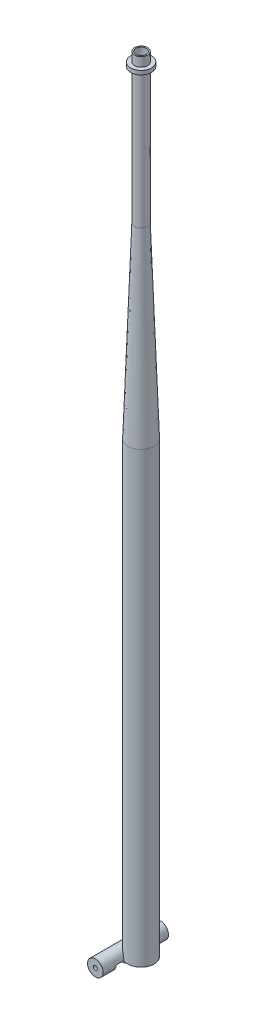
ISO-10303-21;
HEADER;
FILE_DESCRIPTION(('STEP AP214'),'2;1');
FILE_NAME('part.step','',(''),(''),'','','');
FILE_SCHEMA(('AUTOMOTIVE_DESIGN { 1 0 10303 214 1 1 1 1 }'));
ENDSEC;
DATA;
#1=APPLICATION_CONTEXT('core data for automotive mechanical design processes');
#2=APPLICATION_PROTOCOL_DEFINITION('international standard','automotive_design',2000,#1);
#3=PRODUCT_CONTEXT('',#1,'mechanical');
#4=PRODUCT('Part','Part','',(#3));
#5=PRODUCT_RELATED_PRODUCT_CATEGORY('part','',(#4));
#6=PRODUCT_DEFINITION_FORMATION('','',#4);
#7=PRODUCT_DEFINITION_CONTEXT('part definition',#1,'design');
#8=PRODUCT_DEFINITION('design','',#6,#7);
#9=PRODUCT_DEFINITION_SHAPE('','',#8);
#10=(LENGTH_UNIT() NAMED_UNIT(*) SI_UNIT(.MILLI.,.METRE.));
#11=(NAMED_UNIT(*) PLANE_ANGLE_UNIT() SI_UNIT($,.RADIAN.));
#12=(NAMED_UNIT(*) SI_UNIT($,.STERADIAN.) SOLID_ANGLE_UNIT());
#13=UNCERTAINTY_MEASURE_WITH_UNIT(LENGTH_MEASURE(1.E-05),#10,'distance_accuracy_value','');
#14=(GEOMETRIC_REPRESENTATION_CONTEXT(3) GLOBAL_UNCERTAINTY_ASSIGNED_CONTEXT((#13)) GLOBAL_UNIT_ASSIGNED_CONTEXT((#10,
#11,#12)) REPRESENTATION_CONTEXT('',''));
#15=CARTESIAN_POINT('',(0.,0.,0.));
#16=DIRECTION('',(0.,0.,1.));
#17=DIRECTION('',(1.,0.,0.));
#18=AXIS2_PLACEMENT_3D('',#15,#16,#17);
#19=CARTESIAN_POINT('',(0.,0.,0.));
#20=DIRECTION('',(0.,1.,0.));
#21=DIRECTION('',(0.,0.,1.));
#22=AXIS2_PLACEMENT_3D('',#19,#20,#21);
#23=PLANE('',#22);
#24=DIRECTION('',(1.,0.,0.));
#25=VECTOR('',#24,1.);
#26=CARTESIAN_POINT('',(-16.,0.,5.));
#27=LINE('',#26,#25);
#28=CARTESIAN_POINT('',(-16.,0.,5.));
#29=VERTEX_POINT('',#28);
#30=CARTESIAN_POINT('',(-11.5,0.,5.));
#31=VERTEX_POINT('',#30);
#32=EDGE_CURVE('E120',#29,#31,#27,.T.);
#33=ORIENTED_EDGE('',*,*,#32,.T.);
#34=DIRECTION('',(0.,0.,1.));
#35=VECTOR('',#34,1.);
#36=CARTESIAN_POINT('',(-11.5,0.,-25.));
#37=LINE('',#36,#35);
#38=CARTESIAN_POINT('',(-11.5,0.,15.));
#39=VERTEX_POINT('',#38);
#40=EDGE_CURVE('E110',#31,#39,#37,.T.);
#41=ORIENTED_EDGE('',*,*,#40,.T.);
#42=DIRECTION('',(1.,0.,0.));
#43=VECTOR('',#42,1.);
#44=CARTESIAN_POINT('',(-16.,0.,15.));
#45=LINE('',#44,#43);
#46=CARTESIAN_POINT('',(-16.,0.,15.));
#47=VERTEX_POINT('',#46);
#48=EDGE_CURVE('E118',#47,#39,#45,.T.);
#49=ORIENTED_EDGE('',*,*,#48,.F.);
#50=DIRECTION('',(0.,0.,1.));
#51=VECTOR('',#50,1.);
#52=CARTESIAN_POINT('',(-16.,0.,15.));
#53=LINE('',#52,#51);
#54=EDGE_CURVE('E136',#29,#47,#53,.T.);
#55=ORIENTED_EDGE('',*,*,#54,.F.);
#56=EDGE_LOOP('',(#33,#41,#49,#55));
#57=FACE_BOUND('',#56,.T.);
#58=ADVANCED_FACE('F38',(#57),#23,.F.);
#59=DIRECTION('',(1.,0.,0.));
#60=VECTOR('',#59,1.);
#61=CARTESIAN_POINT('',(-16.,0.,-15.));
#62=LINE('',#61,#60);
#63=CARTESIAN_POINT('',(-16.,0.,-15.));
#64=VERTEX_POINT('',#63);
#65=CARTESIAN_POINT('',(-11.5,0.,-15.));
#66=VERTEX_POINT('',#65);
#67=EDGE_CURVE('E145',#64,#66,#62,.T.);
#68=ORIENTED_EDGE('',*,*,#67,.T.);
#69=CARTESIAN_POINT('',(-11.5,0.,-5.));
#70=VERTEX_POINT('',#69);
#71=EDGE_CURVE('E123',#66,#70,#37,.T.);
#72=ORIENTED_EDGE('',*,*,#71,.T.);
#73=DIRECTION('',(1.,0.,0.));
#74=VECTOR('',#73,1.);
#75=CARTESIAN_POINT('',(-16.,0.,-5.));
#76=LINE('',#75,#74);
#77=CARTESIAN_POINT('',(-16.,0.,-5.));
#78=VERTEX_POINT('',#77);
#79=EDGE_CURVE('E149',#78,#70,#76,.T.);
#80=ORIENTED_EDGE('',*,*,#79,.F.);
#81=DIRECTION('',(0.,0.,1.));
#82=VECTOR('',#81,1.);
#83=CARTESIAN_POINT('',(-16.,0.,-5.));
#84=LINE('',#83,#82);
#85=EDGE_CURVE('E140',#64,#78,#84,.T.);
#86=ORIENTED_EDGE('',*,*,#85,.F.);
#87=EDGE_LOOP('',(#68,#72,#80,#86));
#88=FACE_BOUND('',#87,.T.);
#89=ADVANCED_FACE('F201',(#88),#23,.F.);
#90=CARTESIAN_POINT('',(0.,200.,0.));
#91=DIRECTION('',(0.,-1.,0.));
#92=DIRECTION('',(0.,0.,-1.));
#93=AXIS2_PLACEMENT_3D('',#90,#91,#92);
#94=CYLINDRICAL_SURFACE('',#93,10.);
#95=CARTESIAN_POINT('',(0.,343.181266414644,0.));
#96=DIRECTION('',(0.,-1.,0.));
#97=DIRECTION('',(0.,0.,-1.));
#98=AXIS2_PLACEMENT_3D('',#95,#96,#97);
#99=CIRCLE('',#98,10.);
#100=CARTESIAN_POINT('',(0.,343.181266414644,-10.));
#101=VERTEX_POINT('',#100);
#102=EDGE_CURVE('E250',#101,#101,#99,.T.);
#103=ORIENTED_EDGE('',*,*,#102,.T.);
#104=EDGE_LOOP('',(#103));
#105=FACE_BOUND('',#104,.T.);
#106=CARTESIAN_POINT('',(-4.,0.,9.16515138991168));
#107=CARTESIAN_POINT('',(-3.99997778219047,0.153225202512064,9.16513254831111));
#108=CARTESIAN_POINT('',(-4.00586857910908,0.306450219080829,9.16258920397449));
#109=CARTESIAN_POINT('',(-4.02931819606878,0.611833229554031,9.15231657073001));
#110=CARTESIAN_POINT('',(-4.04687727342484,0.763991199852628,9.14458716745645));
#111=CARTESIAN_POINT('',(-4.09350596385244,1.06617006140088,9.12380522893392));
#112=CARTESIAN_POINT('',(-4.12257583952362,1.21619090381464,9.11075257224359));
#113=CARTESIAN_POINT('',(-4.19190300986143,1.51302060117775,9.07906439958033));
#114=CARTESIAN_POINT('',(-4.23215998148825,1.6598295487421,9.06042904481278));
#115=CARTESIAN_POINT('',(-4.32345484793833,1.94933213960151,9.01722165662655));
#116=CARTESIAN_POINT('',(-4.37450386776996,2.09202136221083,8.99264349326236));
#117=CARTESIAN_POINT('',(-4.48674524799118,2.37208311001329,8.93717145606689));
#118=CARTESIAN_POINT('',(-4.54793743293795,2.50945572711524,8.90627769147223));
#119=CARTESIAN_POINT('',(-4.67964207350768,2.77778899230716,8.83778544132786));
#120=CARTESIAN_POINT('',(-4.75014770052152,2.9087542427811,8.80019186109412));
#121=CARTESIAN_POINT('',(-4.89956904335798,3.16344770693432,8.71788356873646));
#122=CARTESIAN_POINT('',(-4.97848459089161,3.28717606535266,8.67316899910017));
#123=CARTESIAN_POINT('',(-5.14261199535865,3.52511212963572,8.57685724328394));
#124=CARTESIAN_POINT('',(-5.22773553618571,3.63941737809661,8.52535044304135));
#125=CARTESIAN_POINT('',(-5.40389792806963,3.85949644005836,8.41479034397009));
#126=CARTESIAN_POINT('',(-5.49493669192846,3.96527037927022,8.35573715637249));
#127=CARTESIAN_POINT('',(-5.68162079935943,4.16780175220397,8.22993625906027));
#128=CARTESIAN_POINT('',(-5.7772664627874,4.26455855849594,8.16318801463022));
#129=CARTESIAN_POINT('',(-5.97178183929896,4.44875287168095,8.02198618883176));
#130=CARTESIAN_POINT('',(-6.07065160490569,4.53619022665366,7.94753248189232));
#131=CARTESIAN_POINT('',(-6.27111108039896,4.70239205559036,7.79034841165227));
#132=CARTESIAN_POINT('',(-6.37271710852397,4.78107302667334,7.70755069973457));
#133=CARTESIAN_POINT('',(-6.57642174218811,4.92899170301371,7.53448994532213));
#134=CARTESIAN_POINT('',(-6.67852033927459,4.99822956972541,7.44422703050676));
#135=CARTESIAN_POINT('',(-6.88195825565414,5.12760689326641,7.25656955593302));
#136=CARTESIAN_POINT('',(-6.98329741133182,5.18774444019384,7.15917350547678));
#137=CARTESIAN_POINT('',(-7.18406481740443,5.29940658545861,6.95769043402865));
#138=CARTESIAN_POINT('',(-7.28349268226228,5.35092946188812,6.85360208111633));
#139=CARTESIAN_POINT('',(-7.51626263559682,5.46383495915283,6.59891419464829));
#140=CARTESIAN_POINT('',(-7.64830909338256,5.52164734670514,6.44553479598772));
#141=CARTESIAN_POINT('',(-7.90477090859937,5.62397522715187,6.12831515057242));
#142=CARTESIAN_POINT('',(-8.02918389829309,5.66848661076545,5.96447168993211));
#143=CARTESIAN_POINT('',(-8.26899071996326,5.74626213413622,5.62731437860279));
#144=CARTESIAN_POINT('',(-8.38436719861967,5.77950502279746,5.45398334226739));
#145=CARTESIAN_POINT('',(-8.60466266264139,5.83660701280445,5.09935093534154));
#146=CARTESIAN_POINT('',(-8.70958128793691,5.86046579113325,4.91804929062806));
#147=CARTESIAN_POINT('',(-8.93466427954141,5.90606151090021,4.49915452944504));
#148=CARTESIAN_POINT('',(-9.05140650467224,5.92552624055263,4.25946953787316));
#149=CARTESIAN_POINT('',(-9.26553895648297,5.9558595131586,3.77106649636677));
#150=CARTESIAN_POINT('',(-9.36292434152859,5.96672590747242,3.52234620482945));
#151=CARTESIAN_POINT('',(-9.53753659249294,5.9827934907367,3.0177284499861));
#152=CARTESIAN_POINT('',(-9.61476099670632,5.98799398811299,2.76183011444389));
#153=CARTESIAN_POINT('',(-9.74847920856982,5.99509980955035,2.24465855048996));
#154=CARTESIAN_POINT('',(-9.80497449725853,5.99700536906185,1.98338570748124));
#155=CARTESIAN_POINT('',(-9.89730026275323,5.99930072674919,1.4546915867135));
#156=CARTESIAN_POINT('',(-9.93293275662073,5.99967619825349,1.18723567223012));
#157=CARTESIAN_POINT('',(-9.9824733285806,6.00002562602308,0.65031717369554));
#158=CARTESIAN_POINT('',(-9.99638114767714,5.99999957750159,0.380854565759542));
#159=CARTESIAN_POINT('',(-10.0023812394145,6.00000036053418,-0.158361899833576));
#160=CARTESIAN_POINT('',(-9.99446966848423,6.00002720140469,-0.428115800436205));
#161=CARTESIAN_POINT('',(-9.95687504681856,5.9998741592151,-0.966102278355277));
#162=CARTESIAN_POINT('',(-9.92719176027435,5.99969427391593,-1.23433483916242));
#163=CARTESIAN_POINT('',(-9.84449242361924,5.99813367544932,-1.77907524652317));
#164=CARTESIAN_POINT('',(-9.79052183696139,5.99670131050609,-2.05543859225935));
#165=CARTESIAN_POINT('',(-9.65947263406435,5.9906876427503,-2.60264202932769));
#166=CARTESIAN_POINT('',(-9.58239096641654,5.98610592401808,-2.87348138626867));
#167=CARTESIAN_POINT('',(-9.40575219096876,5.97115738046493,-3.40747550276633));
#168=CARTESIAN_POINT('',(-9.30620279502734,5.96079253885936,-3.67063286418356));
#169=CARTESIAN_POINT('',(-9.0855078166487,5.93094430892148,-4.18716458927452));
#170=CARTESIAN_POINT('',(-8.96436938318733,5.91146393563795,-4.44054215773376));
#171=CARTESIAN_POINT('',(-8.73558350392088,5.86609869151014,-4.87164396528593));
#172=CARTESIAN_POINT('',(-8.63245846375421,5.84314256937369,-5.05208861891003));
#173=CARTESIAN_POINT('',(-8.41585465526807,5.78817483510347,-5.40520643335287));
#174=CARTESIAN_POINT('',(-8.30237825479174,5.75616529041189,-5.5778813580463));
#175=CARTESIAN_POINT('',(-8.06635283015041,5.68122453920425,-5.91405680606877));
#176=CARTESIAN_POINT('',(-7.94381808878375,5.63831027689263,-6.0775710868303));
#177=CARTESIAN_POINT('',(-7.69103792658546,5.53959283645505,-6.39444869318188));
#178=CARTESIAN_POINT('',(-7.56079410698639,5.48379232795966,-6.54781411284619));
#179=CARTESIAN_POINT('',(-7.32052407595796,5.36977481547948,-6.81436582914304));
#180=CARTESIAN_POINT('',(-7.21149724710685,5.31414237177383,-6.92956219969201));
#181=CARTESIAN_POINT('',(-6.99105688450113,5.19250416331599,-7.15189568458479));
#182=CARTESIAN_POINT('',(-6.87964389294637,5.12650073397615,-7.25903460535033));
#183=CARTESIAN_POINT('',(-6.65595554046045,4.98347084449821,-7.46467239996539));
#184=CARTESIAN_POINT('',(-6.54368037873156,4.90644686217662,-7.56317320796531));
#185=CARTESIAN_POINT('',(-6.31995075224077,4.74094860849784,-7.75110098729479));
#186=CARTESIAN_POINT('',(-6.20849629700955,4.65247420439042,-7.84052785340437));
#187=CARTESIAN_POINT('',(-5.98763011674107,4.46342167406336,-8.01048161481178));
#188=CARTESIAN_POINT('',(-5.87823350912391,4.362777925323,-8.09095531626187));
#189=CARTESIAN_POINT('',(-5.6640625991058,4.14999159346871,-8.24230524473547));
#190=CARTESIAN_POINT('',(-5.55928838305744,4.03784879566684,-8.31318129251288));
#191=CARTESIAN_POINT('',(-5.35625836926277,3.80260458350273,-8.44542363441317));
#192=CARTESIAN_POINT('',(-5.25800207391133,3.67950400738706,-8.50679065497363));
#193=CARTESIAN_POINT('',(-5.06975849202509,3.42315636259772,-8.62030371910424));
#194=CARTESIAN_POINT('',(-4.97977053354164,3.28991012005119,-8.67245051229991));
#195=CARTESIAN_POINT('',(-4.81770739902086,3.02742937489506,-8.76341800872111));
#196=CARTESIAN_POINT('',(-4.74474260689511,2.89901743745589,-8.80303424727697));
#197=CARTESIAN_POINT('',(-4.6078342214625,2.63563519882056,-8.87546418102119));
#198=CARTESIAN_POINT('',(-4.54389034979148,2.50066510016652,-8.90827808612806));
#199=CARTESIAN_POINT('',(-4.42583942795345,2.22512994666828,-8.96751414008314));
#200=CARTESIAN_POINT('',(-4.37173306907188,2.08456449948237,-8.99393583979196));
#201=CARTESIAN_POINT('',(-4.27401914659507,1.79886919414208,-9.04077981158458));
#202=CARTESIAN_POINT('',(-4.23041058605309,1.65373977089704,-9.06120265340386));
#203=CARTESIAN_POINT('',(-4.16054503032758,1.38447117446451,-9.09346381467836));
#204=CARTESIAN_POINT('',(-4.13260723291465,1.26086717751727,-9.10616572785124));
#205=CARTESIAN_POINT('',(-4.08457313072066,1.01183197047441,-9.12781208480819));
#206=CARTESIAN_POINT('',(-4.06447584944549,0.886400989939533,-9.13675699651721));
#207=CARTESIAN_POINT('',(-4.03228927003066,0.634453840509129,-9.15100925749045));
#208=CARTESIAN_POINT('',(-4.02019116756719,0.507939020487487,-9.1563206062723));
#209=CARTESIAN_POINT('',(-4.00404090355378,0.254283074171204,-9.16338735149828));
#210=CARTESIAN_POINT('',(-3.99998968534063,0.127141876197441,-9.16514233102949));
#211=CARTESIAN_POINT('',(-4.,0.,-9.16515138991168));
#212=B_SPLINE_CURVE_WITH_KNOTS('',3,(#106,#107,#108,#109,#110,#111,#112,#113,#114,#115,#116,
#117,#118,#119,#120,#121,#122,#123,#124,#125,#126,#127,#128,#129,#130,#131,#132,#133,#134,#135,
#136,#137,#138,#139,#140,#141,#142,#143,#144,#145,#146,#147,#148,#149,#150,#151,#152,#153,#154,
#155,#156,#157,#158,#159,#160,#161,#162,#163,#164,#165,#166,#167,#168,#169,#170,#171,#172,#173,
#174,#175,#176,#177,#178,#179,#180,#181,#182,#183,#184,#185,#186,#187,#188,#189,#190,#191,#192,
#193,#194,#195,#196,#197,#198,#199,#200,#201,#202,#203,#204,#205,#206,#207,#208,#209,#210,#211),
.UNSPECIFIED.,.F.,.F.,(4,2,2,2,2,2,2,2,2,2,2,2,2,2,2,2,2,2,2,2,2,2,2,2,2,2,2,2,2,2,2,2,2,2,2,2,
2,2,2,2,2,2,2,2,2,2,2,2,2,2,2,2,4),(0.,0.459541473371342,0.919093081125991,1.37865517338749,
1.83820399666244,2.29822887727497,2.75824580182619,3.21792729524277,3.6775995918056,
4.13167756877734,4.58574885357255,5.03985170999098,5.49396196780009,5.95208663886993,
6.41020347613011,6.86841632631762,7.32672065528192,7.9572426360196,8.58795921255536,
9.21985871578428,9.85177996815904,10.6526287232293,11.4536775394093,12.2548241199218,
13.0559134495514,13.8644866204113,14.6730694307931,15.4817946853053,16.290528699227,
17.1342762521656,17.9781352561078,18.8217050518707,19.6649960259144,20.2917598722541,
20.9183807060223,21.5440337614615,22.1695573170834,22.6733231005062,23.1769756045158,
23.6805150467634,24.1840603273082,24.6904533966605,25.1968559221237,25.7032197421151,
26.2095423746235,26.667737436832,27.1259183571366,27.58413146154,28.0423010335353,
28.4240725813736,28.8057965664292,29.1870997031511,29.5684475374284),.UNSPECIFIED.);
#213=CARTESIAN_POINT('',(-4.,0.,9.16515138991168));
#214=VERTEX_POINT('',#213);
#215=CARTESIAN_POINT('',(-4.,0.,-9.16515138991169));
#216=VERTEX_POINT('',#215);
#217=EDGE_CURVE('E153',#214,#216,#212,.T.);
#218=ORIENTED_EDGE('',*,*,#217,.F.);
#219=CARTESIAN_POINT('',(0.,0.,0.));
#220=DIRECTION('',(0.,1.,0.));
#221=DIRECTION('',(0.,0.,1.));
#222=AXIS2_PLACEMENT_3D('',#219,#220,#221);
#223=CIRCLE('',#222,10.);
#224=EDGE_CURVE('E222',#214,#216,#223,.T.);
#225=ORIENTED_EDGE('',*,*,#224,.T.);
#226=EDGE_LOOP('',(#218,#225));
#227=FACE_BOUND('',#226,.T.);
#228=ADVANCED_FACE('F166',(#105,#227),#94,.T.);
#229=CARTESIAN_POINT('',(-8.5,0.,15.));
#230=VERTEX_POINT('',#229);
#231=CARTESIAN_POINT('',(-4.,0.,15.));
#232=VERTEX_POINT('',#231);
#233=EDGE_CURVE('E129',#230,#232,#45,.T.);
#234=ORIENTED_EDGE('',*,*,#233,.F.);
#235=DIRECTION('',(0.,0.,1.));
#236=VECTOR('',#235,1.);
#237=CARTESIAN_POINT('',(-8.5,0.,-25.));
#238=LINE('',#237,#236);
#239=CARTESIAN_POINT('',(-8.5,0.,5.));
#240=VERTEX_POINT('',#239);
#241=EDGE_CURVE('E61',#230,#240,#238,.F.);
#242=ORIENTED_EDGE('',*,*,#241,.T.);
#243=CARTESIAN_POINT('',(-4.,0.,5.));
#244=VERTEX_POINT('',#243);
#245=EDGE_CURVE('E139',#240,#244,#27,.T.);
#246=ORIENTED_EDGE('',*,*,#245,.T.);
#247=DIRECTION('',(0.,0.,-1.));
#248=VECTOR('',#247,1.);
#249=CARTESIAN_POINT('',(-4.,0.,25.));
#250=LINE('',#249,#248);
#251=CARTESIAN_POINT('',(-4.,0.,0.));
#252=VERTEX_POINT('',#251);
#253=EDGE_CURVE('E240',#252,#244,#250,.F.);
#254=ORIENTED_EDGE('',*,*,#253,.F.);
#255=CARTESIAN_POINT('',(0.,0.,0.));
#256=DIRECTION('',(0.,1.,0.));
#257=DIRECTION('',(0.,0.,1.));
#258=AXIS2_PLACEMENT_3D('',#255,#256,#257);
#259=CIRCLE('',#258,4.);
#260=EDGE_CURVE('E260',#252,#252,#259,.T.);
#261=ORIENTED_EDGE('',*,*,#260,.T.);
#262=CARTESIAN_POINT('',(-4.,0.,-5.));
#263=VERTEX_POINT('',#262);
#264=EDGE_CURVE('E239',#263,#252,#250,.F.);
#265=ORIENTED_EDGE('',*,*,#264,.F.);
#266=CARTESIAN_POINT('',(-8.5,0.,-5.));
#267=VERTEX_POINT('',#266);
#268=EDGE_CURVE('E143',#267,#263,#76,.T.);
#269=ORIENTED_EDGE('',*,*,#268,.F.);
#270=CARTESIAN_POINT('',(-8.5,0.,-15.));
#271=VERTEX_POINT('',#270);
#272=EDGE_CURVE('E53',#267,#271,#238,.F.);
#273=ORIENTED_EDGE('',*,*,#272,.T.);
#274=CARTESIAN_POINT('',(-4.,0.,-15.));
#275=VERTEX_POINT('',#274);
#276=EDGE_CURVE('E148',#271,#275,#62,.T.);
#277=ORIENTED_EDGE('',*,*,#276,.T.);
#278=DIRECTION('',(0.,0.,-1.));
#279=VECTOR('',#278,1.);
#280=CARTESIAN_POINT('',(-4.,0.,25.));
#281=LINE('',#280,#279);
#282=EDGE_CURVE('E227',#216,#275,#281,.T.);
#283=ORIENTED_EDGE('',*,*,#282,.F.);
#284=ORIENTED_EDGE('',*,*,#224,.F.);
#285=DIRECTION('',(0.,0.,-1.));
#286=VECTOR('',#285,1.);
#287=CARTESIAN_POINT('',(-4.,0.,25.));
#288=LINE('',#287,#286);
#289=EDGE_CURVE('E46',#232,#214,#288,.T.);
#290=ORIENTED_EDGE('',*,*,#289,.F.);
#291=EDGE_LOOP('',(#234,#242,#246,#254,#261,#265,#269,#273,#277,#283,#284,#290));
#292=FACE_BOUND('',#291,.T.);
#293=ADVANCED_FACE('F203',(#292),#23,.F.);
#294=CARTESIAN_POINT('',(0.,600.,0.));
#295=DIRECTION('',(0.,-1.,0.));
#296=DIRECTION('',(0.,0.,-1.));
#297=AXIS2_PLACEMENT_3D('',#294,#295,#296);
#298=CYLINDRICAL_SURFACE('',#297,5.);
#299=CARTESIAN_POINT('',(0.,486.362532829231,0.));
#300=DIRECTION('',(0.,1.,0.));
#301=DIRECTION('',(0.,0.,1.));
#302=AXIS2_PLACEMENT_3D('',#299,#300,#301);
#303=CIRCLE('',#302,5.);
#304=CARTESIAN_POINT('',(0.,486.362532829231,5.));
#305=VERTEX_POINT('',#304);
#306=EDGE_CURVE('E253',#305,#305,#303,.T.);
#307=ORIENTED_EDGE('',*,*,#306,.T.);
#308=EDGE_LOOP('',(#307));
#309=FACE_BOUND('',#308,.T.);
#310=CARTESIAN_POINT('',(0.,590.,0.));
#311=DIRECTION('',(0.,1.,0.));
#312=DIRECTION('',(0.,0.,1.));
#313=AXIS2_PLACEMENT_3D('',#310,#311,#312);
#314=CIRCLE('',#313,5.);
#315=CARTESIAN_POINT('',(0.,590.,5.));
#316=VERTEX_POINT('',#315);
#317=EDGE_CURVE('E243',#316,#316,#314,.T.);
#318=ORIENTED_EDGE('',*,*,#317,.F.);
#319=EDGE_LOOP('',(#318));
#320=FACE_BOUND('',#319,.T.);
#321=ADVANCED_FACE('F209',(#309,#320),#298,.T.);
#322=CARTESIAN_POINT('',(0.,593.,0.));
#323=DIRECTION('',(0.,1.,0.));
#324=DIRECTION('',(0.,0.,1.));
#325=AXIS2_PLACEMENT_3D('',#322,#323,#324);
#326=CIRCLE('',#325,5.);
#327=CARTESIAN_POINT('',(0.,593.,5.));
#328=VERTEX_POINT('',#327);
#329=EDGE_CURVE('E244',#328,#328,#326,.T.);
#330=ORIENTED_EDGE('',*,*,#329,.T.);
#331=EDGE_LOOP('',(#330));
#332=FACE_BOUND('',#331,.T.);
#333=CARTESIAN_POINT('',(0.,600.,0.));
#334=DIRECTION('',(0.,1.,0.));
#335=DIRECTION('',(0.,0.,1.));
#336=AXIS2_PLACEMENT_3D('',#333,#334,#335);
#337=CIRCLE('',#336,5.);
#338=CARTESIAN_POINT('',(0.,600.,5.));
#339=VERTEX_POINT('',#338);
#340=EDGE_CURVE('E256',#339,#339,#337,.T.);
#341=ORIENTED_EDGE('',*,*,#340,.F.);
#342=EDGE_LOOP('',(#341));
#343=FACE_BOUND('',#342,.T.);
#344=ADVANCED_FACE('F215',(#332,#343),#298,.T.);
#345=CARTESIAN_POINT('',(0.,600.,0.));
#346=DIRECTION('',(0.,1.,0.));
#347=DIRECTION('',(0.,0.,1.));
#348=AXIS2_PLACEMENT_3D('',#345,#346,#347);
#349=PLANE('',#348);
#350=CARTESIAN_POINT('',(0.,600.,0.));
#351=DIRECTION('',(0.,1.,0.));
#352=DIRECTION('',(0.,0.,1.));
#353=AXIS2_PLACEMENT_3D('',#350,#351,#352);
#354=CIRCLE('',#353,4.);
#355=CARTESIAN_POINT('',(0.,600.,4.));
#356=VERTEX_POINT('',#355);
#357=EDGE_CURVE('E247',#356,#356,#354,.T.);
#358=ORIENTED_EDGE('',*,*,#357,.F.);
#359=EDGE_LOOP('',(#358));
#360=FACE_BOUND('',#359,.T.);
#361=ORIENTED_EDGE('',*,*,#340,.T.);
#362=EDGE_LOOP('',(#361));
#363=FACE_BOUND('',#362,.T.);
#364=ADVANCED_FACE('F196',(#360,#363),#349,.T.);
#365=CARTESIAN_POINT('',(0.,486.362532829231,0.));
#366=DIRECTION('',(0.,-1.,0.));
#367=DIRECTION('',(0.,0.,-1.));
#368=AXIS2_PLACEMENT_3D('',#365,#366,#367);
#369=CONICAL_SURFACE('',#368,5.,0.0349065850398845);
#370=ORIENTED_EDGE('',*,*,#102,.F.);
#371=EDGE_LOOP('',(#370));
#372=FACE_BOUND('',#371,.T.);
#373=ORIENTED_EDGE('',*,*,#306,.F.);
#374=EDGE_LOOP('',(#373));
#375=FACE_BOUND('',#374,.T.);
#376=ADVANCED_FACE('F40',(#372,#375),#369,.T.);
#377=CARTESIAN_POINT('',(0.,0.,0.));
#378=DIRECTION('',(0.,1.,0.));
#379=DIRECTION('',(0.,0.,1.));
#380=AXIS2_PLACEMENT_3D('',#377,#378,#379);
#381=CYLINDRICAL_SURFACE('',#380,4.);
#382=ORIENTED_EDGE('',*,*,#260,.F.);
#383=EDGE_LOOP('',(#382));
#384=FACE_BOUND('',#383,.T.);
#385=ORIENTED_EDGE('',*,*,#357,.T.);
#386=EDGE_LOOP('',(#385));
#387=FACE_BOUND('',#386,.T.);
#388=ADVANCED_FACE('F184',(#384,#387),#381,.F.);
#389=CARTESIAN_POINT('',(0.,593.,0.));
#390=DIRECTION('',(0.,1.,0.));
#391=DIRECTION('',(0.,0.,1.));
#392=AXIS2_PLACEMENT_3D('',#389,#390,#391);
#393=PLANE('',#392);
#394=ORIENTED_EDGE('',*,*,#329,.F.);
#395=EDGE_LOOP('',(#394));
#396=FACE_BOUND('',#395,.T.);
#397=CARTESIAN_POINT('',(0.,593.,0.));
#398=DIRECTION('',(0.,1.,0.));
#399=DIRECTION('',(0.,0.,1.));
#400=AXIS2_PLACEMENT_3D('',#397,#398,#399);
#401=CIRCLE('',#400,8.);
#402=CARTESIAN_POINT('',(0.,593.,8.));
#403=VERTEX_POINT('',#402);
#404=EDGE_CURVE('E164',#403,#403,#401,.T.);
#405=ORIENTED_EDGE('',*,*,#404,.T.);
#406=EDGE_LOOP('',(#405));
#407=FACE_BOUND('',#406,.T.);
#408=ADVANCED_FACE('F180',(#396,#407),#393,.T.);
#409=CARTESIAN_POINT('',(0.,590.,0.));
#410=DIRECTION('',(0.,1.,0.));
#411=DIRECTION('',(0.,0.,1.));
#412=AXIS2_PLACEMENT_3D('',#409,#410,#411);
#413=PLANE('',#412);
#414=ORIENTED_EDGE('',*,*,#317,.T.);
#415=EDGE_LOOP('',(#414));
#416=FACE_BOUND('',#415,.T.);
#417=CARTESIAN_POINT('',(0.,590.,0.));
#418=DIRECTION('',(0.,1.,0.));
#419=DIRECTION('',(0.,0.,1.));
#420=AXIS2_PLACEMENT_3D('',#417,#418,#419);
#421=CIRCLE('',#420,8.);
#422=CARTESIAN_POINT('',(0.,590.,8.));
#423=VERTEX_POINT('',#422);
#424=EDGE_CURVE('E163',#423,#423,#421,.T.);
#425=ORIENTED_EDGE('',*,*,#424,.F.);
#426=EDGE_LOOP('',(#425));
#427=FACE_BOUND('',#426,.T.);
#428=ADVANCED_FACE('F183',(#416,#427),#413,.F.);
#429=CARTESIAN_POINT('',(0.,593.,0.));
#430=DIRECTION('',(0.,-1.,0.));
#431=DIRECTION('',(0.,0.,-1.));
#432=AXIS2_PLACEMENT_3D('',#429,#430,#431);
#433=CYLINDRICAL_SURFACE('',#432,8.);
#434=ORIENTED_EDGE('',*,*,#404,.F.);
#435=EDGE_LOOP('',(#434));
#436=FACE_BOUND('',#435,.T.);
#437=ORIENTED_EDGE('',*,*,#424,.T.);
#438=EDGE_LOOP('',(#437));
#439=FACE_BOUND('',#438,.T.);
#440=ADVANCED_FACE('F176',(#436,#439),#433,.T.);
#441=CARTESIAN_POINT('',(-10.,0.,25.));
#442=DIRECTION('',(0.,0.,-1.));
#443=DIRECTION('',(-1.,0.,0.));
#444=AXIS2_PLACEMENT_3D('',#441,#442,#443);
#445=CYLINDRICAL_SURFACE('',#444,6.);
#446=CARTESIAN_POINT('',(-10.,0.,15.));
#447=DIRECTION('',(0.,0.,1.));
#448=DIRECTION('',(0.,-1.,0.));
#449=AXIS2_PLACEMENT_3D('',#446,#447,#448);
#450=CIRCLE('',#449,6.);
#451=EDGE_CURVE('E126',#47,#232,#450,.T.);
#452=ORIENTED_EDGE('',*,*,#451,.T.);
#453=ORIENTED_EDGE('',*,*,#289,.T.);
#454=ORIENTED_EDGE('',*,*,#217,.T.);
#455=ORIENTED_EDGE('',*,*,#282,.T.);
#456=CARTESIAN_POINT('',(-10.,0.,-15.));
#457=DIRECTION('',(0.,0.,-1.));
#458=DIRECTION('',(0.,1.,0.));
#459=AXIS2_PLACEMENT_3D('',#456,#457,#458);
#460=CIRCLE('',#459,6.);
#461=EDGE_CURVE('E231',#275,#64,#460,.T.);
#462=ORIENTED_EDGE('',*,*,#461,.T.);
#463=ORIENTED_EDGE('',*,*,#85,.T.);
#464=CARTESIAN_POINT('',(-10.,0.,-5.));
#465=DIRECTION('',(0.,0.,1.));
#466=DIRECTION('',(1.,0.,0.));
#467=AXIS2_PLACEMENT_3D('',#464,#465,#466);
#468=CIRCLE('',#467,6.);
#469=EDGE_CURVE('E236',#78,#263,#468,.T.);
#470=ORIENTED_EDGE('',*,*,#469,.T.);
#471=ORIENTED_EDGE('',*,*,#264,.T.);
#472=ORIENTED_EDGE('',*,*,#253,.T.);
#473=CARTESIAN_POINT('',(-10.,0.,5.));
#474=DIRECTION('',(0.,0.,-1.));
#475=DIRECTION('',(0.,1.,0.));
#476=AXIS2_PLACEMENT_3D('',#473,#474,#475);
#477=CIRCLE('',#476,6.);
#478=EDGE_CURVE('E224',#244,#29,#477,.T.);
#479=ORIENTED_EDGE('',*,*,#478,.T.);
#480=ORIENTED_EDGE('',*,*,#54,.T.);
#481=EDGE_LOOP('',(#452,#453,#454,#455,#462,#463,#470,#471,#472,#479,#480));
#482=FACE_BOUND('',#481,.T.);
#483=CARTESIAN_POINT('',(-10.,0.,25.));
#484=DIRECTION('',(0.,0.,1.));
#485=DIRECTION('',(1.,0.,0.));
#486=AXIS2_PLACEMENT_3D('',#483,#484,#485);
#487=CIRCLE('',#486,6.);
#488=CARTESIAN_POINT('',(-4.,0.,25.));
#489=VERTEX_POINT('',#488);
#490=EDGE_CURVE('E132',#489,#489,#487,.T.);
#491=ORIENTED_EDGE('',*,*,#490,.F.);
#492=EDGE_LOOP('',(#491));
#493=FACE_BOUND('',#492,.T.);
#494=CARTESIAN_POINT('',(-10.,0.,-25.));
#495=DIRECTION('',(0.,0.,1.));
#496=DIRECTION('',(1.,0.,0.));
#497=AXIS2_PLACEMENT_3D('',#494,#495,#496);
#498=CIRCLE('',#497,6.);
#499=CARTESIAN_POINT('',(-4.,0.,-25.));
#500=VERTEX_POINT('',#499);
#501=EDGE_CURVE('E128',#500,#500,#498,.T.);
#502=ORIENTED_EDGE('',*,*,#501,.T.);
#503=EDGE_LOOP('',(#502));
#504=FACE_BOUND('',#503,.T.);
#505=ADVANCED_FACE('F170',(#482,#493,#504),#445,.T.);
#506=CARTESIAN_POINT('',(-10.,0.,25.));
#507=DIRECTION('',(0.,0.,1.));
#508=DIRECTION('',(1.,0.,0.));
#509=AXIS2_PLACEMENT_3D('',#506,#507,#508);
#510=PLANE('',#509);
#511=CARTESIAN_POINT('',(-10.,0.,25.));
#512=DIRECTION('',(0.,0.,1.));
#513=DIRECTION('',(1.,0.,0.));
#514=AXIS2_PLACEMENT_3D('',#511,#512,#513);
#515=CIRCLE('',#514,1.5);
#516=CARTESIAN_POINT('',(-8.5,0.,25.));
#517=VERTEX_POINT('',#516);
#518=EDGE_CURVE('E313',#517,#517,#515,.T.);
#519=ORIENTED_EDGE('',*,*,#518,.F.);
#520=EDGE_LOOP('',(#519));
#521=FACE_BOUND('',#520,.T.);
#522=ORIENTED_EDGE('',*,*,#490,.T.);
#523=EDGE_LOOP('',(#522));
#524=FACE_BOUND('',#523,.T.);
#525=ADVANCED_FACE('F175',(#521,#524),#510,.T.);
#526=CARTESIAN_POINT('',(-10.,0.,-25.));
#527=DIRECTION('',(0.,0.,1.));
#528=DIRECTION('',(1.,0.,0.));
#529=AXIS2_PLACEMENT_3D('',#526,#527,#528);
#530=PLANE('',#529);
#531=CARTESIAN_POINT('',(-10.,0.,-25.));
#532=DIRECTION('',(0.,0.,1.));
#533=DIRECTION('',(1.,0.,0.));
#534=AXIS2_PLACEMENT_3D('',#531,#532,#533);
#535=CIRCLE('',#534,1.5);
#536=CARTESIAN_POINT('',(-8.5,0.,-25.));
#537=VERTEX_POINT('',#536);
#538=EDGE_CURVE('E319',#537,#537,#535,.T.);
#539=ORIENTED_EDGE('',*,*,#538,.T.);
#540=EDGE_LOOP('',(#539));
#541=FACE_BOUND('',#540,.T.);
#542=ORIENTED_EDGE('',*,*,#501,.F.);
#543=EDGE_LOOP('',(#542));
#544=FACE_BOUND('',#543,.T.);
#545=ADVANCED_FACE('F178',(#541,#544),#530,.F.);
#546=CARTESIAN_POINT('',(-16.,-13.3402914148452,-15.));
#547=DIRECTION('',(0.,0.,-1.));
#548=DIRECTION('',(0.,1.,0.));
#549=AXIS2_PLACEMENT_3D('',#546,#547,#548);
#550=PLANE('',#549);
#551=ORIENTED_EDGE('',*,*,#276,.F.);
#552=CARTESIAN_POINT('',(-10.,0.,-15.));
#553=DIRECTION('',(0.,0.,-1.));
#554=DIRECTION('',(0.,1.,0.));
#555=AXIS2_PLACEMENT_3D('',#552,#553,#554);
#556=CIRCLE('',#555,1.5);
#557=EDGE_CURVE('E144',#271,#66,#556,.T.);
#558=ORIENTED_EDGE('',*,*,#557,.T.);
#559=ORIENTED_EDGE('',*,*,#67,.F.);
#560=ORIENTED_EDGE('',*,*,#461,.F.);
#561=EDGE_LOOP('',(#551,#558,#559,#560));
#562=FACE_BOUND('',#561,.T.);
#563=ADVANCED_FACE('F285',(#562),#550,.F.);
#564=CARTESIAN_POINT('',(-16.,-13.3402914148452,-5.));
#565=DIRECTION('',(0.,0.,1.));
#566=DIRECTION('',(1.,0.,0.));
#567=AXIS2_PLACEMENT_3D('',#564,#565,#566);
#568=PLANE('',#567);
#569=ORIENTED_EDGE('',*,*,#79,.T.);
#570=CARTESIAN_POINT('',(-10.,0.,-5.));
#571=DIRECTION('',(0.,0.,1.));
#572=DIRECTION('',(1.,0.,0.));
#573=AXIS2_PLACEMENT_3D('',#570,#571,#572);
#574=CIRCLE('',#573,1.5);
#575=EDGE_CURVE('E279',#70,#267,#574,.T.);
#576=ORIENTED_EDGE('',*,*,#575,.T.);
#577=ORIENTED_EDGE('',*,*,#268,.T.);
#578=ORIENTED_EDGE('',*,*,#469,.F.);
#579=EDGE_LOOP('',(#569,#576,#577,#578));
#580=FACE_BOUND('',#579,.T.);
#581=ADVANCED_FACE('F278',(#580),#568,.F.);
#582=CARTESIAN_POINT('',(-16.,0.,5.));
#583=DIRECTION('',(0.,0.,-1.));
#584=DIRECTION('',(0.,1.,0.));
#585=AXIS2_PLACEMENT_3D('',#582,#583,#584);
#586=PLANE('',#585);
#587=ORIENTED_EDGE('',*,*,#245,.F.);
#588=CARTESIAN_POINT('',(-10.,0.,5.));
#589=DIRECTION('',(0.,0.,-1.));
#590=DIRECTION('',(0.,1.,0.));
#591=AXIS2_PLACEMENT_3D('',#588,#589,#590);
#592=CIRCLE('',#591,1.5);
#593=EDGE_CURVE('E121',#240,#31,#592,.T.);
#594=ORIENTED_EDGE('',*,*,#593,.T.);
#595=ORIENTED_EDGE('',*,*,#32,.F.);
#596=ORIENTED_EDGE('',*,*,#478,.F.);
#597=EDGE_LOOP('',(#587,#594,#595,#596));
#598=FACE_BOUND('',#597,.T.);
#599=ADVANCED_FACE('F292',(#598),#586,.F.);
#600=CARTESIAN_POINT('',(-16.,0.,15.));
#601=DIRECTION('',(0.,0.,1.));
#602=DIRECTION('',(0.,-1.,0.));
#603=AXIS2_PLACEMENT_3D('',#600,#601,#602);
#604=PLANE('',#603);
#605=ORIENTED_EDGE('',*,*,#48,.T.);
#606=CARTESIAN_POINT('',(-10.,0.,15.));
#607=DIRECTION('',(0.,0.,1.));
#608=DIRECTION('',(0.,-1.,0.));
#609=AXIS2_PLACEMENT_3D('',#606,#607,#608);
#610=CIRCLE('',#609,1.5);
#611=EDGE_CURVE('E11',#39,#230,#610,.T.);
#612=ORIENTED_EDGE('',*,*,#611,.T.);
#613=ORIENTED_EDGE('',*,*,#233,.T.);
#614=ORIENTED_EDGE('',*,*,#451,.F.);
#615=EDGE_LOOP('',(#605,#612,#613,#614));
#616=FACE_BOUND('',#615,.T.);
#617=ADVANCED_FACE('F124',(#616),#604,.F.);
#618=CARTESIAN_POINT('',(-10.,0.,-25.));
#619=DIRECTION('',(0.,0.,1.));
#620=DIRECTION('',(1.,0.,0.));
#621=AXIS2_PLACEMENT_3D('',#618,#619,#620);
#622=CYLINDRICAL_SURFACE('',#621,1.5);
#623=ORIENTED_EDGE('',*,*,#538,.F.);
#624=EDGE_LOOP('',(#623));
#625=FACE_BOUND('',#624,.T.);
#626=ORIENTED_EDGE('',*,*,#518,.T.);
#627=EDGE_LOOP('',(#626));
#628=FACE_BOUND('',#627,.T.);
#629=ORIENTED_EDGE('',*,*,#241,.F.);
#630=ORIENTED_EDGE('',*,*,#611,.F.);
#631=ORIENTED_EDGE('',*,*,#40,.F.);
#632=ORIENTED_EDGE('',*,*,#593,.F.);
#633=EDGE_LOOP('',(#629,#630,#631,#632));
#634=FACE_BOUND('',#633,.T.);
#635=ORIENTED_EDGE('',*,*,#272,.F.);
#636=ORIENTED_EDGE('',*,*,#575,.F.);
#637=ORIENTED_EDGE('',*,*,#71,.F.);
#638=ORIENTED_EDGE('',*,*,#557,.F.);
#639=EDGE_LOOP('',(#635,#636,#637,#638));
#640=FACE_BOUND('',#639,.T.);
#641=ADVANCED_FACE('F109',(#625,#628,#634,#640),#622,.F.);
#642=CLOSED_SHELL('',(#58,#89,#228,#293,#321,#344,#364,#376,#388,#408,#428,#440,#505,#525,#545,
#563,#581,#599,#617,#641));
#643=MANIFOLD_SOLID_BREP('B2',#642);
#644=ADVANCED_BREP_SHAPE_REPRESENTATION('',(#18,#643),#14);
#645=SHAPE_DEFINITION_REPRESENTATION(#9,#644);
ENDSEC;
END-ISO-10303-21;
